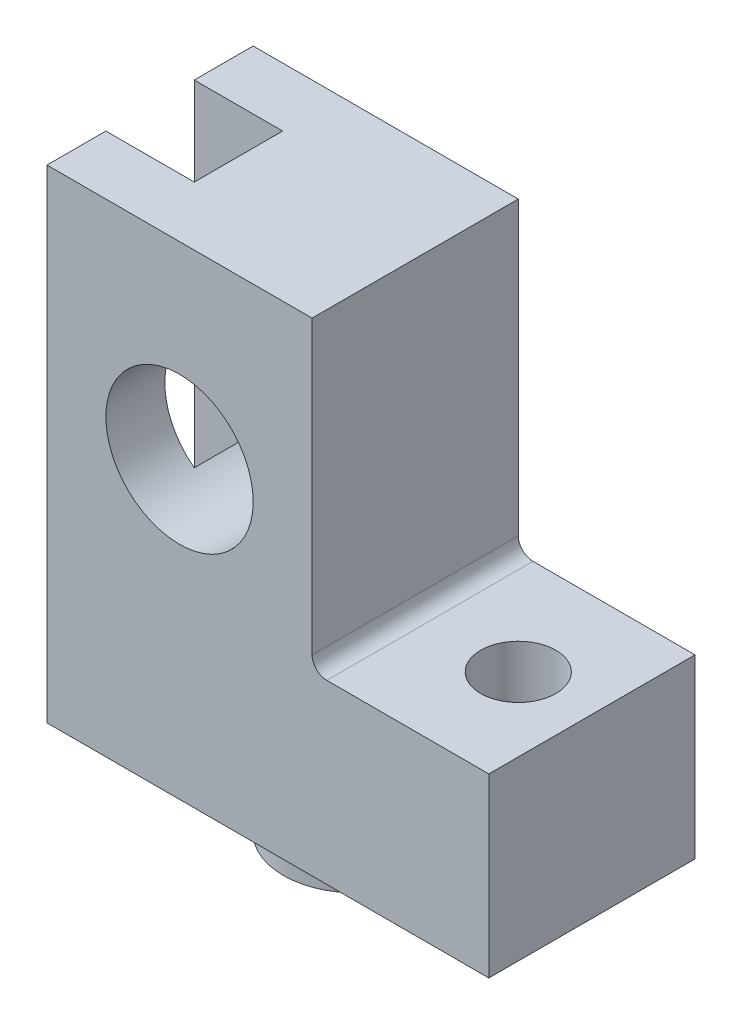
ISO-10303-21;
HEADER;
FILE_DESCRIPTION(('STEP AP214'),'2;1');
FILE_NAME('part.step','',(''),(''),'','','');
FILE_SCHEMA(('AUTOMOTIVE_DESIGN { 1 0 10303 214 1 1 1 1 }'));
ENDSEC;
DATA;
#1=APPLICATION_CONTEXT('core data for automotive mechanical design processes');
#2=APPLICATION_PROTOCOL_DEFINITION('international standard','automotive_design',2000,#1);
#3=PRODUCT_CONTEXT('',#1,'mechanical');
#4=PRODUCT('Part','Part','',(#3));
#5=PRODUCT_RELATED_PRODUCT_CATEGORY('part','',(#4));
#6=PRODUCT_DEFINITION_FORMATION('','',#4);
#7=PRODUCT_DEFINITION_CONTEXT('part definition',#1,'design');
#8=PRODUCT_DEFINITION('design','',#6,#7);
#9=PRODUCT_DEFINITION_SHAPE('','',#8);
#10=(LENGTH_UNIT() NAMED_UNIT(*) SI_UNIT(.MILLI.,.METRE.));
#11=(NAMED_UNIT(*) PLANE_ANGLE_UNIT() SI_UNIT($,.RADIAN.));
#12=(NAMED_UNIT(*) SI_UNIT($,.STERADIAN.) SOLID_ANGLE_UNIT());
#13=UNCERTAINTY_MEASURE_WITH_UNIT(LENGTH_MEASURE(1.E-05),#10,'distance_accuracy_value','');
#14=(GEOMETRIC_REPRESENTATION_CONTEXT(3) GLOBAL_UNCERTAINTY_ASSIGNED_CONTEXT((#13)) GLOBAL_UNIT_ASSIGNED_CONTEXT((#10,
#11,#12)) REPRESENTATION_CONTEXT('',''));
#15=CARTESIAN_POINT('',(0.,0.,0.));
#16=DIRECTION('',(0.,0.,1.));
#17=DIRECTION('',(1.,0.,0.));
#18=AXIS2_PLACEMENT_3D('',#15,#16,#17);
#19=CARTESIAN_POINT('',(-21.,0.,7.));
#20=DIRECTION('',(0.,1.,0.));
#21=DIRECTION('',(-1.,0.,0.));
#22=AXIS2_PLACEMENT_3D('',#19,#20,#21);
#23=PLANE('',#22);
#24=DIRECTION('',(-1.,0.,0.));
#25=VECTOR('',#24,1.);
#26=CARTESIAN_POINT('',(-9.,0.,-2.99999999999999));
#27=LINE('',#26,#25);
#28=CARTESIAN_POINT('',(-3.,0.,-2.99999999999999));
#29=VERTEX_POINT('',#28);
#30=CARTESIAN_POINT('',(-9.,0.,-2.99999999999999));
#31=VERTEX_POINT('',#30);
#32=EDGE_CURVE('E151',#29,#31,#27,.T.);
#33=ORIENTED_EDGE('',*,*,#32,.T.);
#34=DIRECTION('',(0.,0.,-1.));
#35=VECTOR('',#34,1.);
#36=CARTESIAN_POINT('',(-9.,0.,-7.));
#37=LINE('',#36,#35);
#38=CARTESIAN_POINT('',(-9.,0.,-7.));
#39=VERTEX_POINT('',#38);
#40=EDGE_CURVE('E135',#31,#39,#37,.T.);
#41=ORIENTED_EDGE('',*,*,#40,.T.);
#42=DIRECTION('',(1.,0.,0.));
#43=VECTOR('',#42,1.);
#44=CARTESIAN_POINT('',(-21.,0.,-7.));
#45=LINE('',#44,#43);
#46=CARTESIAN_POINT('',(21.,0.,-7.));
#47=VERTEX_POINT('',#46);
#48=EDGE_CURVE('E142',#39,#47,#45,.T.);
#49=ORIENTED_EDGE('',*,*,#48,.T.);
#50=DIRECTION('',(0.,0.,-1.));
#51=VECTOR('',#50,1.);
#52=CARTESIAN_POINT('',(21.,0.,7.));
#53=LINE('',#52,#51);
#54=CARTESIAN_POINT('',(21.,0.,7.));
#55=VERTEX_POINT('',#54);
#56=EDGE_CURVE('E179',#55,#47,#53,.T.);
#57=ORIENTED_EDGE('',*,*,#56,.F.);
#58=DIRECTION('',(1.,0.,0.));
#59=VECTOR('',#58,1.);
#60=CARTESIAN_POINT('',(-21.,0.,7.));
#61=LINE('',#60,#59);
#62=CARTESIAN_POINT('',(-9.,0.,7.));
#63=VERTEX_POINT('',#62);
#64=EDGE_CURVE('E287',#63,#55,#61,.T.);
#65=ORIENTED_EDGE('',*,*,#64,.F.);
#66=DIRECTION('',(0.,0.,-1.));
#67=VECTOR('',#66,1.);
#68=CARTESIAN_POINT('',(-9.,0.,3.00000000000001));
#69=LINE('',#68,#67);
#70=CARTESIAN_POINT('',(-9.,0.,3.00000000000001));
#71=VERTEX_POINT('',#70);
#72=EDGE_CURVE('E152',#63,#71,#69,.T.);
#73=ORIENTED_EDGE('',*,*,#72,.T.);
#74=DIRECTION('',(1.,0.,0.));
#75=VECTOR('',#74,1.);
#76=CARTESIAN_POINT('',(-9.,0.,3.00000000000001));
#77=LINE('',#76,#75);
#78=CARTESIAN_POINT('',(-3.,0.,3.));
#79=VERTEX_POINT('',#78);
#80=EDGE_CURVE('E294',#71,#79,#77,.T.);
#81=ORIENTED_EDGE('',*,*,#80,.T.);
#82=DIRECTION('',(0.,0.,-1.));
#83=VECTOR('',#82,1.);
#84=CARTESIAN_POINT('',(-3.,0.,-2.99999999999999));
#85=LINE('',#84,#83);
#86=EDGE_CURVE('E445',#79,#29,#85,.T.);
#87=ORIENTED_EDGE('',*,*,#86,.T.);
#88=EDGE_LOOP('',(#33,#41,#49,#57,#65,#73,#81,#87));
#89=FACE_BOUND('',#88,.T.);
#90=CARTESIAN_POINT('',(16.,0.,0.));
#91=DIRECTION('',(0.,1.,0.));
#92=DIRECTION('',(0.,0.,1.));
#93=AXIS2_PLACEMENT_3D('',#90,#91,#92);
#94=CIRCLE('',#93,2.55);
#95=CARTESIAN_POINT('',(16.,0.,2.55));
#96=VERTEX_POINT('',#95);
#97=EDGE_CURVE('E276',#96,#96,#94,.T.);
#98=ORIENTED_EDGE('',*,*,#97,.T.);
#99=EDGE_LOOP('',(#98));
#100=FACE_BOUND('',#99,.T.);
#101=CARTESIAN_POINT('',(5.,0.,0.));
#102=DIRECTION('',(0.,1.,0.));
#103=DIRECTION('',(-1.,0.,0.));
#104=AXIS2_PLACEMENT_3D('',#101,#102,#103);
#105=CIRCLE('',#104,4.95);
#106=CARTESIAN_POINT('',(0.0500000000000049,0.,0.));
#107=VERTEX_POINT('',#106);
#108=EDGE_CURVE('E11',#107,#107,#105,.F.);
#109=ORIENTED_EDGE('',*,*,#108,.F.);
#110=EDGE_LOOP('',(#109));
#111=FACE_BOUND('',#110,.T.);
#112=ADVANCED_FACE('F35',(#89,#100,#111),#23,.F.);
#113=CARTESIAN_POINT('',(-8.99999999999999,12.,7.));
#114=DIRECTION('',(1.,0.,0.));
#115=DIRECTION('',(0.,1.,0.));
#116=AXIS2_PLACEMENT_3D('',#113,#114,#115);
#117=PLANE('',#116);
#118=DIRECTION('',(0.,-1.,0.));
#119=VECTOR('',#118,1.);
#120=CARTESIAN_POINT('',(-8.99999999999999,12.,-7.));
#121=LINE('',#120,#119);
#122=CARTESIAN_POINT('',(-9.,32.8,-7.));
#123=VERTEX_POINT('',#122);
#124=EDGE_CURVE('E132',#123,#39,#121,.T.);
#125=ORIENTED_EDGE('',*,*,#124,.T.);
#126=ORIENTED_EDGE('',*,*,#40,.F.);
#127=DIRECTION('',(0.,1.,0.));
#128=VECTOR('',#127,1.);
#129=CARTESIAN_POINT('',(-9.,0.,-2.99999999999999));
#130=LINE('',#129,#128);
#131=CARTESIAN_POINT('',(-9.,32.8,-2.99999999999999));
#132=VERTEX_POINT('',#131);
#133=EDGE_CURVE('E264',#31,#132,#130,.T.);
#134=ORIENTED_EDGE('',*,*,#133,.T.);
#135=DIRECTION('',(0.,0.,-1.));
#136=VECTOR('',#135,1.);
#137=CARTESIAN_POINT('',(-9.,32.8,7.));
#138=LINE('',#137,#136);
#139=EDGE_CURVE('E138',#132,#123,#138,.T.);
#140=ORIENTED_EDGE('',*,*,#139,.T.);
#141=EDGE_LOOP('',(#125,#126,#134,#140));
#142=FACE_BOUND('',#141,.T.);
#143=ADVANCED_FACE('F134',(#142),#117,.F.);
#144=CARTESIAN_POINT('',(-9.,32.8,7.));
#145=DIRECTION('',(0.,0.,1.));
#146=DIRECTION('',(1.,0.,0.));
#147=AXIS2_PLACEMENT_3D('',#144,#145,#146);
#148=PLANE('',#147);
#149=DIRECTION('',(0.,-1.,0.));
#150=VECTOR('',#149,1.);
#151=CARTESIAN_POINT('',(-8.99999999999999,12.,7.));
#152=LINE('',#151,#150);
#153=CARTESIAN_POINT('',(-9.,32.8,7.));
#154=VERTEX_POINT('',#153);
#155=EDGE_CURVE('E169',#154,#63,#152,.T.);
#156=ORIENTED_EDGE('',*,*,#155,.T.);
#157=ORIENTED_EDGE('',*,*,#64,.T.);
#158=DIRECTION('',(0.,1.,0.));
#159=VECTOR('',#158,1.);
#160=CARTESIAN_POINT('',(21.,0.,7.));
#161=LINE('',#160,#159);
#162=CARTESIAN_POINT('',(21.,12.,7.));
#163=VERTEX_POINT('',#162);
#164=EDGE_CURVE('E289',#55,#163,#161,.T.);
#165=ORIENTED_EDGE('',*,*,#164,.T.);
#166=DIRECTION('',(-1.,0.,0.));
#167=VECTOR('',#166,1.);
#168=CARTESIAN_POINT('',(21.,12.,7.));
#169=LINE('',#168,#167);
#170=CARTESIAN_POINT('',(10.,12.,7.));
#171=VERTEX_POINT('',#170);
#172=EDGE_CURVE('E201',#163,#171,#169,.T.);
#173=ORIENTED_EDGE('',*,*,#172,.T.);
#174=CARTESIAN_POINT('',(10.,13.,7.));
#175=DIRECTION('',(0.,0.,1.));
#176=DIRECTION('',(1.,0.,0.));
#177=AXIS2_PLACEMENT_3D('',#174,#175,#176);
#178=CIRCLE('',#177,1.);
#179=CARTESIAN_POINT('',(9.,13.,7.));
#180=VERTEX_POINT('',#179);
#181=EDGE_CURVE('E43',#171,#180,#178,.F.);
#182=ORIENTED_EDGE('',*,*,#181,.T.);
#183=DIRECTION('',(0.,1.,0.));
#184=VECTOR('',#183,1.);
#185=CARTESIAN_POINT('',(9.,12.,7.));
#186=LINE('',#185,#184);
#187=CARTESIAN_POINT('',(9.,32.8,7.));
#188=VERTEX_POINT('',#187);
#189=EDGE_CURVE('E199',#180,#188,#186,.T.);
#190=ORIENTED_EDGE('',*,*,#189,.T.);
#191=DIRECTION('',(-1.,0.,0.));
#192=VECTOR('',#191,1.);
#193=CARTESIAN_POINT('',(9.,32.8,7.));
#194=LINE('',#193,#192);
#195=EDGE_CURVE('E207',#188,#154,#194,.T.);
#196=ORIENTED_EDGE('',*,*,#195,.T.);
#197=EDGE_LOOP('',(#156,#157,#165,#173,#182,#190,#196));
#198=FACE_BOUND('',#197,.T.);
#199=CARTESIAN_POINT('',(0.,20.,7.));
#200=DIRECTION('',(0.,0.,1.));
#201=DIRECTION('',(1.,0.,0.));
#202=AXIS2_PLACEMENT_3D('',#199,#200,#201);
#203=CIRCLE('',#202,5.);
#204=CARTESIAN_POINT('',(5.,20.,7.));
#205=VERTEX_POINT('',#204);
#206=EDGE_CURVE('E143',#205,#205,#203,.T.);
#207=ORIENTED_EDGE('',*,*,#206,.F.);
#208=EDGE_LOOP('',(#207));
#209=FACE_BOUND('',#208,.T.);
#210=ADVANCED_FACE('F197',(#198,#209),#148,.T.);
#211=CARTESIAN_POINT('',(-9.,32.8,-7.));
#212=DIRECTION('',(0.,0.,1.));
#213=DIRECTION('',(1.,0.,0.));
#214=AXIS2_PLACEMENT_3D('',#211,#212,#213);
#215=PLANE('',#214);
#216=ORIENTED_EDGE('',*,*,#48,.F.);
#217=ORIENTED_EDGE('',*,*,#124,.F.);
#218=DIRECTION('',(-1.,0.,0.));
#219=VECTOR('',#218,1.);
#220=CARTESIAN_POINT('',(9.,32.8,-7.));
#221=LINE('',#220,#219);
#222=CARTESIAN_POINT('',(9.,32.8,-7.));
#223=VERTEX_POINT('',#222);
#224=EDGE_CURVE('E167',#223,#123,#221,.T.);
#225=ORIENTED_EDGE('',*,*,#224,.F.);
#226=DIRECTION('',(0.,1.,0.));
#227=VECTOR('',#226,1.);
#228=CARTESIAN_POINT('',(9.,12.,-7.));
#229=LINE('',#228,#227);
#230=CARTESIAN_POINT('',(9.,13.,-7.));
#231=VERTEX_POINT('',#230);
#232=EDGE_CURVE('E165',#231,#223,#229,.T.);
#233=ORIENTED_EDGE('',*,*,#232,.F.);
#234=CARTESIAN_POINT('',(10.,13.,-7.));
#235=DIRECTION('',(0.,0.,1.));
#236=DIRECTION('',(1.,0.,0.));
#237=AXIS2_PLACEMENT_3D('',#234,#235,#236);
#238=CIRCLE('',#237,1.);
#239=CARTESIAN_POINT('',(10.,12.,-7.));
#240=VERTEX_POINT('',#239);
#241=EDGE_CURVE('E58',#231,#240,#238,.T.);
#242=ORIENTED_EDGE('',*,*,#241,.T.);
#243=DIRECTION('',(-1.,0.,0.));
#244=VECTOR('',#243,1.);
#245=CARTESIAN_POINT('',(21.,12.,-7.));
#246=LINE('',#245,#244);
#247=CARTESIAN_POINT('',(21.,12.,-7.));
#248=VERTEX_POINT('',#247);
#249=EDGE_CURVE('E160',#248,#240,#246,.T.);
#250=ORIENTED_EDGE('',*,*,#249,.F.);
#251=DIRECTION('',(0.,1.,0.));
#252=VECTOR('',#251,1.);
#253=CARTESIAN_POINT('',(21.,0.,-7.));
#254=LINE('',#253,#252);
#255=EDGE_CURVE('E158',#47,#248,#254,.T.);
#256=ORIENTED_EDGE('',*,*,#255,.F.);
#257=EDGE_LOOP('',(#216,#217,#225,#233,#242,#250,#256));
#258=FACE_BOUND('',#257,.T.);
#259=CARTESIAN_POINT('',(0.,20.,-7.));
#260=DIRECTION('',(0.,0.,1.));
#261=DIRECTION('',(1.,0.,0.));
#262=AXIS2_PLACEMENT_3D('',#259,#260,#261);
#263=CIRCLE('',#262,5.);
#264=CARTESIAN_POINT('',(5.,20.,-7.));
#265=VERTEX_POINT('',#264);
#266=EDGE_CURVE('E279',#265,#265,#263,.T.);
#267=ORIENTED_EDGE('',*,*,#266,.T.);
#268=EDGE_LOOP('',(#267));
#269=FACE_BOUND('',#268,.T.);
#270=ADVANCED_FACE('F156',(#258,#269),#215,.F.);
#271=CARTESIAN_POINT('',(-9.,32.8,3.00000000000001));
#272=VERTEX_POINT('',#271);
#273=EDGE_CURVE('E170',#154,#272,#138,.T.);
#274=ORIENTED_EDGE('',*,*,#273,.T.);
#275=DIRECTION('',(0.,1.,0.));
#276=VECTOR('',#275,1.);
#277=CARTESIAN_POINT('',(-9.,0.,3.00000000000001));
#278=LINE('',#277,#276);
#279=EDGE_CURVE('E243',#71,#272,#278,.T.);
#280=ORIENTED_EDGE('',*,*,#279,.F.);
#281=ORIENTED_EDGE('',*,*,#72,.F.);
#282=ORIENTED_EDGE('',*,*,#155,.F.);
#283=EDGE_LOOP('',(#274,#280,#281,#282));
#284=FACE_BOUND('',#283,.T.);
#285=ADVANCED_FACE('F227',(#284),#117,.F.);
#286=CARTESIAN_POINT('',(21.,0.,7.));
#287=DIRECTION('',(-1.,0.,0.));
#288=DIRECTION('',(0.,-1.,0.));
#289=AXIS2_PLACEMENT_3D('',#286,#287,#288);
#290=PLANE('',#289);
#291=ORIENTED_EDGE('',*,*,#255,.T.);
#292=DIRECTION('',(0.,0.,-1.));
#293=VECTOR('',#292,1.);
#294=CARTESIAN_POINT('',(21.,12.,7.));
#295=LINE('',#294,#293);
#296=EDGE_CURVE('E176',#163,#248,#295,.T.);
#297=ORIENTED_EDGE('',*,*,#296,.F.);
#298=ORIENTED_EDGE('',*,*,#164,.F.);
#299=ORIENTED_EDGE('',*,*,#56,.T.);
#300=EDGE_LOOP('',(#291,#297,#298,#299));
#301=FACE_BOUND('',#300,.T.);
#302=ADVANCED_FACE('F229',(#301),#290,.F.);
#303=CARTESIAN_POINT('',(21.,12.,7.));
#304=DIRECTION('',(0.,-1.,0.));
#305=DIRECTION('',(1.,0.,0.));
#306=AXIS2_PLACEMENT_3D('',#303,#304,#305);
#307=PLANE('',#306);
#308=CARTESIAN_POINT('',(16.,12.,0.));
#309=DIRECTION('',(0.,1.,0.));
#310=DIRECTION('',(0.,0.,1.));
#311=AXIS2_PLACEMENT_3D('',#308,#309,#310);
#312=CIRCLE('',#311,2.55);
#313=CARTESIAN_POINT('',(16.,12.,2.55));
#314=VERTEX_POINT('',#313);
#315=EDGE_CURVE('E266',#314,#314,#312,.T.);
#316=ORIENTED_EDGE('',*,*,#315,.F.);
#317=EDGE_LOOP('',(#316));
#318=FACE_BOUND('',#317,.T.);
#319=ORIENTED_EDGE('',*,*,#249,.T.);
#320=DIRECTION('',(0.,0.,-1.));
#321=VECTOR('',#320,1.);
#322=CARTESIAN_POINT('',(10.,12.,7.));
#323=LINE('',#322,#321);
#324=EDGE_CURVE('E50',#240,#171,#323,.F.);
#325=ORIENTED_EDGE('',*,*,#324,.T.);
#326=ORIENTED_EDGE('',*,*,#172,.F.);
#327=ORIENTED_EDGE('',*,*,#296,.T.);
#328=EDGE_LOOP('',(#319,#325,#326,#327));
#329=FACE_BOUND('',#328,.T.);
#330=ADVANCED_FACE('F237',(#318,#329),#307,.F.);
#331=CARTESIAN_POINT('',(9.,12.,7.));
#332=DIRECTION('',(-1.,0.,0.));
#333=DIRECTION('',(0.,0.,1.));
#334=AXIS2_PLACEMENT_3D('',#331,#332,#333);
#335=PLANE('',#334);
#336=ORIENTED_EDGE('',*,*,#189,.F.);
#337=DIRECTION('',(0.,0.,-1.));
#338=VECTOR('',#337,1.);
#339=CARTESIAN_POINT('',(9.,13.,-7.));
#340=LINE('',#339,#338);
#341=EDGE_CURVE('E190',#180,#231,#340,.T.);
#342=ORIENTED_EDGE('',*,*,#341,.T.);
#343=ORIENTED_EDGE('',*,*,#232,.T.);
#344=DIRECTION('',(0.,0.,-1.));
#345=VECTOR('',#344,1.);
#346=CARTESIAN_POINT('',(9.,32.8,7.));
#347=LINE('',#346,#345);
#348=EDGE_CURVE('E173',#188,#223,#347,.T.);
#349=ORIENTED_EDGE('',*,*,#348,.F.);
#350=EDGE_LOOP('',(#336,#342,#343,#349));
#351=FACE_BOUND('',#350,.T.);
#352=ADVANCED_FACE('F205',(#351),#335,.F.);
#353=CARTESIAN_POINT('',(9.,32.8,7.));
#354=DIRECTION('',(0.,-1.,0.));
#355=DIRECTION('',(0.,0.,-1.));
#356=AXIS2_PLACEMENT_3D('',#353,#354,#355);
#357=PLANE('',#356);
#358=ORIENTED_EDGE('',*,*,#139,.F.);
#359=DIRECTION('',(-1.,0.,0.));
#360=VECTOR('',#359,1.);
#361=CARTESIAN_POINT('',(-9.,32.8,-2.99999999999999));
#362=LINE('',#361,#360);
#363=CARTESIAN_POINT('',(-3.,32.8,-2.99999999999999));
#364=VERTEX_POINT('',#363);
#365=EDGE_CURVE('E153',#364,#132,#362,.T.);
#366=ORIENTED_EDGE('',*,*,#365,.F.);
#367=DIRECTION('',(0.,0.,-1.));
#368=VECTOR('',#367,1.);
#369=CARTESIAN_POINT('',(-3.,32.8,-2.99999999999999));
#370=LINE('',#369,#368);
#371=CARTESIAN_POINT('',(-3.,32.8,3.));
#372=VERTEX_POINT('',#371);
#373=EDGE_CURVE('E253',#372,#364,#370,.T.);
#374=ORIENTED_EDGE('',*,*,#373,.F.);
#375=DIRECTION('',(1.,0.,0.));
#376=VECTOR('',#375,1.);
#377=CARTESIAN_POINT('',(-9.,32.8,3.00000000000001));
#378=LINE('',#377,#376);
#379=EDGE_CURVE('E250',#272,#372,#378,.T.);
#380=ORIENTED_EDGE('',*,*,#379,.F.);
#381=ORIENTED_EDGE('',*,*,#273,.F.);
#382=ORIENTED_EDGE('',*,*,#195,.F.);
#383=ORIENTED_EDGE('',*,*,#348,.T.);
#384=ORIENTED_EDGE('',*,*,#224,.T.);
#385=EDGE_LOOP('',(#358,#366,#374,#380,#381,#382,#383,#384));
#386=FACE_BOUND('',#385,.T.);
#387=ADVANCED_FACE('F247',(#386),#357,.F.);
#388=CARTESIAN_POINT('',(0.,20.,7.));
#389=DIRECTION('',(0.,0.,-1.));
#390=DIRECTION('',(-1.,0.,0.));
#391=AXIS2_PLACEMENT_3D('',#388,#389,#390);
#392=CYLINDRICAL_SURFACE('',#391,5.);
#393=CARTESIAN_POINT('',(0.,20.,-2.99999999999999));
#394=DIRECTION('',(0.,0.,-1.));
#395=DIRECTION('',(-1.,0.,0.));
#396=AXIS2_PLACEMENT_3D('',#393,#394,#395);
#397=CIRCLE('',#396,5.);
#398=CARTESIAN_POINT('',(-3.,16.,-2.99999999999999));
#399=VERTEX_POINT('',#398);
#400=CARTESIAN_POINT('',(-3.,24.,-2.99999999999999));
#401=VERTEX_POINT('',#400);
#402=EDGE_CURVE('E188',#399,#401,#397,.T.);
#403=ORIENTED_EDGE('',*,*,#402,.F.);
#404=DIRECTION('',(0.,0.,-1.));
#405=VECTOR('',#404,1.);
#406=CARTESIAN_POINT('',(-3.,16.,7.));
#407=LINE('',#406,#405);
#408=CARTESIAN_POINT('',(-3.,16.,3.));
#409=VERTEX_POINT('',#408);
#410=EDGE_CURVE('E186',#409,#399,#407,.T.);
#411=ORIENTED_EDGE('',*,*,#410,.F.);
#412=CARTESIAN_POINT('',(0.,20.,3.));
#413=DIRECTION('',(0.,0.,1.));
#414=DIRECTION('',(1.,0.,0.));
#415=AXIS2_PLACEMENT_3D('',#412,#413,#414);
#416=CIRCLE('',#415,5.);
#417=CARTESIAN_POINT('',(-3.,24.,3.));
#418=VERTEX_POINT('',#417);
#419=EDGE_CURVE('E181',#418,#409,#416,.T.);
#420=ORIENTED_EDGE('',*,*,#419,.F.);
#421=DIRECTION('',(0.,0.,-1.));
#422=VECTOR('',#421,1.);
#423=CARTESIAN_POINT('',(-3.,24.,7.));
#424=LINE('',#423,#422);
#425=EDGE_CURVE('E183',#401,#418,#424,.F.);
#426=ORIENTED_EDGE('',*,*,#425,.F.);
#427=EDGE_LOOP('',(#403,#411,#420,#426));
#428=FACE_BOUND('',#427,.T.);
#429=ORIENTED_EDGE('',*,*,#206,.T.);
#430=EDGE_LOOP('',(#429));
#431=FACE_BOUND('',#430,.T.);
#432=ORIENTED_EDGE('',*,*,#266,.F.);
#433=EDGE_LOOP('',(#432));
#434=FACE_BOUND('',#433,.T.);
#435=ADVANCED_FACE('F307',(#428,#431,#434),#392,.F.);
#436=CARTESIAN_POINT('',(16.,0.,0.));
#437=DIRECTION('',(0.,1.,0.));
#438=DIRECTION('',(0.,0.,1.));
#439=AXIS2_PLACEMENT_3D('',#436,#437,#438);
#440=CYLINDRICAL_SURFACE('',#439,2.55);
#441=ORIENTED_EDGE('',*,*,#97,.F.);
#442=EDGE_LOOP('',(#441));
#443=FACE_BOUND('',#442,.T.);
#444=ORIENTED_EDGE('',*,*,#315,.T.);
#445=EDGE_LOOP('',(#444));
#446=FACE_BOUND('',#445,.T.);
#447=ADVANCED_FACE('F313',(#443,#446),#440,.F.);
#448=CARTESIAN_POINT('',(-3.,0.,-2.99999999999999));
#449=DIRECTION('',(1.,0.,0.));
#450=DIRECTION('',(0.,0.,-1.));
#451=AXIS2_PLACEMENT_3D('',#448,#449,#450);
#452=PLANE('',#451);
#453=ORIENTED_EDGE('',*,*,#410,.T.);
#454=DIRECTION('',(0.,1.,0.));
#455=VECTOR('',#454,1.);
#456=CARTESIAN_POINT('',(-3.,0.,-2.99999999999999));
#457=LINE('',#456,#455);
#458=EDGE_CURVE('E267',#29,#399,#457,.T.);
#459=ORIENTED_EDGE('',*,*,#458,.F.);
#460=ORIENTED_EDGE('',*,*,#86,.F.);
#461=DIRECTION('',(0.,1.,0.));
#462=VECTOR('',#461,1.);
#463=CARTESIAN_POINT('',(-3.,0.,3.));
#464=LINE('',#463,#462);
#465=EDGE_CURVE('E271',#79,#409,#464,.T.);
#466=ORIENTED_EDGE('',*,*,#465,.T.);
#467=EDGE_LOOP('',(#453,#459,#460,#466));
#468=FACE_BOUND('',#467,.T.);
#469=ADVANCED_FACE('F316',(#468),#452,.F.);
#470=CARTESIAN_POINT('',(-9.,0.,-2.99999999999999));
#471=DIRECTION('',(0.,0.,-1.));
#472=DIRECTION('',(-1.,0.,0.));
#473=AXIS2_PLACEMENT_3D('',#470,#471,#472);
#474=PLANE('',#473);
#475=ORIENTED_EDGE('',*,*,#402,.T.);
#476=EDGE_CURVE('E270',#401,#364,#457,.T.);
#477=ORIENTED_EDGE('',*,*,#476,.T.);
#478=ORIENTED_EDGE('',*,*,#365,.T.);
#479=ORIENTED_EDGE('',*,*,#133,.F.);
#480=ORIENTED_EDGE('',*,*,#32,.F.);
#481=ORIENTED_EDGE('',*,*,#458,.T.);
#482=EDGE_LOOP('',(#475,#477,#478,#479,#480,#481));
#483=FACE_BOUND('',#482,.T.);
#484=ADVANCED_FACE('F321',(#483),#474,.F.);
#485=ORIENTED_EDGE('',*,*,#425,.T.);
#486=EDGE_CURVE('E274',#418,#372,#464,.T.);
#487=ORIENTED_EDGE('',*,*,#486,.T.);
#488=ORIENTED_EDGE('',*,*,#373,.T.);
#489=ORIENTED_EDGE('',*,*,#476,.F.);
#490=EDGE_LOOP('',(#485,#487,#488,#489));
#491=FACE_BOUND('',#490,.T.);
#492=ADVANCED_FACE('F219',(#491),#452,.F.);
#493=CARTESIAN_POINT('',(-9.,0.,3.00000000000001));
#494=DIRECTION('',(0.,0.,1.));
#495=DIRECTION('',(1.,0.,0.));
#496=AXIS2_PLACEMENT_3D('',#493,#494,#495);
#497=PLANE('',#496);
#498=ORIENTED_EDGE('',*,*,#419,.T.);
#499=ORIENTED_EDGE('',*,*,#465,.F.);
#500=ORIENTED_EDGE('',*,*,#80,.F.);
#501=ORIENTED_EDGE('',*,*,#279,.T.);
#502=ORIENTED_EDGE('',*,*,#379,.T.);
#503=ORIENTED_EDGE('',*,*,#486,.F.);
#504=EDGE_LOOP('',(#498,#499,#500,#501,#502,#503));
#505=FACE_BOUND('',#504,.T.);
#506=ADVANCED_FACE('F211',(#505),#497,.F.);
#507=CARTESIAN_POINT('',(10.,13.,7.));
#508=DIRECTION('',(0.,0.,1.));
#509=DIRECTION('',(1.,0.,0.));
#510=AXIS2_PLACEMENT_3D('',#507,#508,#509);
#511=CYLINDRICAL_SURFACE('',#510,1.);
#512=ORIENTED_EDGE('',*,*,#181,.F.);
#513=ORIENTED_EDGE('',*,*,#324,.F.);
#514=ORIENTED_EDGE('',*,*,#241,.F.);
#515=ORIENTED_EDGE('',*,*,#341,.F.);
#516=EDGE_LOOP('',(#512,#513,#514,#515));
#517=FACE_BOUND('',#516,.T.);
#518=ADVANCED_FACE('F37',(#517),#511,.F.);
#519=CARTESIAN_POINT('',(5.,-3.,0.));
#520=DIRECTION('',(0.,1.,0.));
#521=DIRECTION('',(-1.,0.,0.));
#522=AXIS2_PLACEMENT_3D('',#519,#520,#521);
#523=CYLINDRICAL_SURFACE('',#522,4.95);
#524=CARTESIAN_POINT('',(5.,-3.,0.));
#525=DIRECTION('',(0.,-1.,0.));
#526=DIRECTION('',(1.,0.,0.));
#527=AXIS2_PLACEMENT_3D('',#524,#525,#526);
#528=CIRCLE('',#527,4.95);
#529=CARTESIAN_POINT('',(9.95,-3.,0.));
#530=VERTEX_POINT('',#529);
#531=EDGE_CURVE('E254',#530,#530,#528,.T.);
#532=ORIENTED_EDGE('',*,*,#531,.F.);
#533=EDGE_LOOP('',(#532));
#534=FACE_BOUND('',#533,.T.);
#535=ORIENTED_EDGE('',*,*,#108,.T.);
#536=EDGE_LOOP('',(#535));
#537=FACE_BOUND('',#536,.T.);
#538=ADVANCED_FACE('F210',(#534,#537),#523,.T.);
#539=CARTESIAN_POINT('',(5.,-3.,0.));
#540=DIRECTION('',(0.,-1.,0.));
#541=DIRECTION('',(1.,0.,0.));
#542=AXIS2_PLACEMENT_3D('',#539,#540,#541);
#543=PLANE('',#542);
#544=ORIENTED_EDGE('',*,*,#531,.T.);
#545=EDGE_LOOP('',(#544));
#546=FACE_BOUND('',#545,.T.);
#547=ADVANCED_FACE('F216',(#546),#543,.T.);
#548=CLOSED_SHELL('',(#112,#143,#210,#270,#285,#302,#330,#352,#387,#435,#447,#469,#484,#492,
#506,#518,#538,#547));
#549=MANIFOLD_SOLID_BREP('B2',#548);
#550=ADVANCED_BREP_SHAPE_REPRESENTATION('',(#18,#549),#14);
#551=SHAPE_DEFINITION_REPRESENTATION(#9,#550);
ENDSEC;
END-ISO-10303-21;
